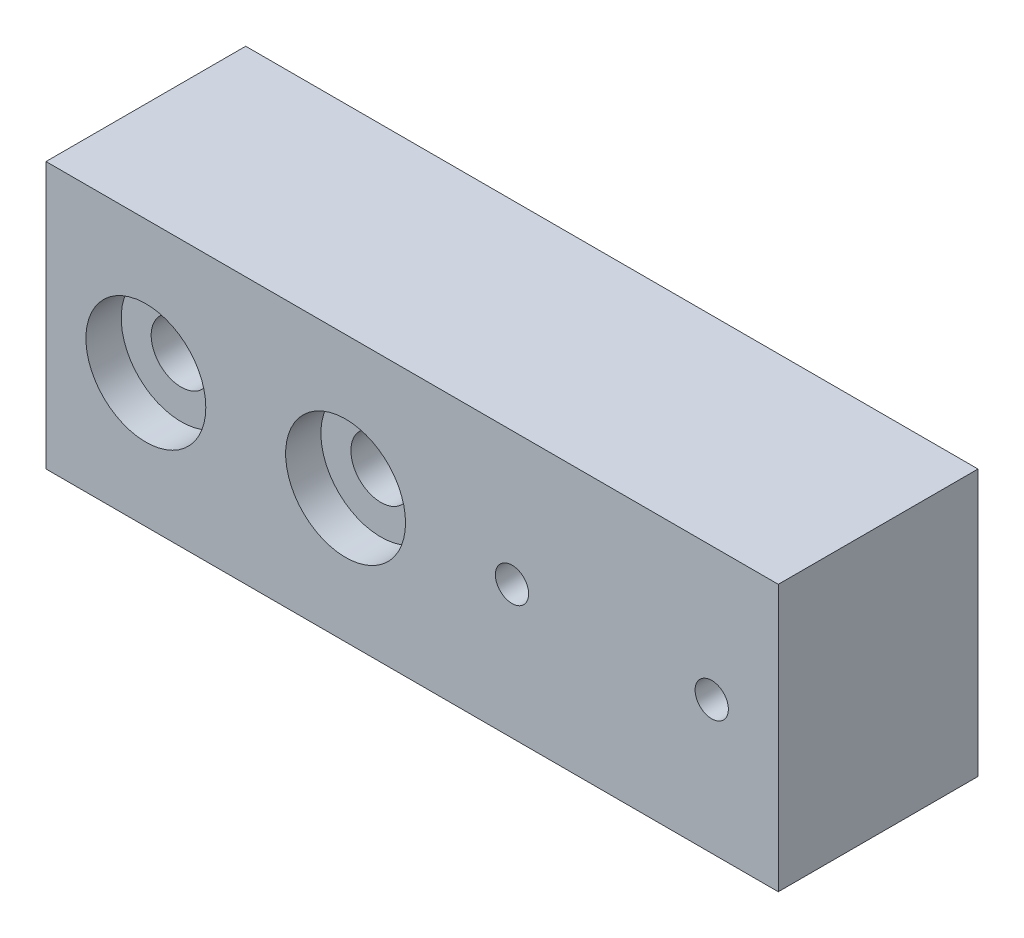
ISO-10303-21;
HEADER;
FILE_DESCRIPTION(('STEP AP214'),'2;1');
FILE_NAME('part.step','',(''),(''),'','','');
FILE_SCHEMA(('AUTOMOTIVE_DESIGN { 1 0 10303 214 1 1 1 1 }'));
ENDSEC;
DATA;
#1=APPLICATION_CONTEXT('core data for automotive mechanical design processes');
#2=APPLICATION_PROTOCOL_DEFINITION('international standard','automotive_design',2000,#1);
#3=PRODUCT_CONTEXT('',#1,'mechanical');
#4=PRODUCT('Part','Part','',(#3));
#5=PRODUCT_RELATED_PRODUCT_CATEGORY('part','',(#4));
#6=PRODUCT_DEFINITION_FORMATION('','',#4);
#7=PRODUCT_DEFINITION_CONTEXT('part definition',#1,'design');
#8=PRODUCT_DEFINITION('design','',#6,#7);
#9=PRODUCT_DEFINITION_SHAPE('','',#8);
#10=(LENGTH_UNIT() NAMED_UNIT(*) SI_UNIT(.MILLI.,.METRE.));
#11=(NAMED_UNIT(*) PLANE_ANGLE_UNIT() SI_UNIT($,.RADIAN.));
#12=(NAMED_UNIT(*) SI_UNIT($,.STERADIAN.) SOLID_ANGLE_UNIT());
#13=UNCERTAINTY_MEASURE_WITH_UNIT(LENGTH_MEASURE(1.E-05),#10,'distance_accuracy_value','');
#14=(GEOMETRIC_REPRESENTATION_CONTEXT(3) GLOBAL_UNCERTAINTY_ASSIGNED_CONTEXT((#13)) GLOBAL_UNIT_ASSIGNED_CONTEXT((#10,
#11,#12)) REPRESENTATION_CONTEXT('',''));
#15=CARTESIAN_POINT('',(0.,0.,0.));
#16=DIRECTION('',(0.,0.,1.));
#17=DIRECTION('',(1.,0.,0.));
#18=AXIS2_PLACEMENT_3D('',#15,#16,#17);
#19=CARTESIAN_POINT('',(-55.,-20.,30.));
#20=DIRECTION('',(1.,0.,0.));
#21=DIRECTION('',(0.,0.,-1.));
#22=AXIS2_PLACEMENT_3D('',#19,#20,#21);
#23=PLANE('',#22);
#24=DIRECTION('',(0.,-1.,0.));
#25=VECTOR('',#24,1.);
#26=CARTESIAN_POINT('',(-55.,-20.,0.));
#27=LINE('',#26,#25);
#28=CARTESIAN_POINT('',(-55.,20.,0.));
#29=VERTEX_POINT('',#28);
#30=CARTESIAN_POINT('',(-55.,-20.,0.));
#31=VERTEX_POINT('',#30);
#32=EDGE_CURVE('E144',#29,#31,#27,.T.);
#33=ORIENTED_EDGE('',*,*,#32,.T.);
#34=DIRECTION('',(0.,0.,-1.));
#35=VECTOR('',#34,1.);
#36=CARTESIAN_POINT('',(-55.,-20.,30.));
#37=LINE('',#36,#35);
#38=CARTESIAN_POINT('',(-55.,-20.,30.));
#39=VERTEX_POINT('',#38);
#40=EDGE_CURVE('E11',#39,#31,#37,.T.);
#41=ORIENTED_EDGE('',*,*,#40,.F.);
#42=DIRECTION('',(0.,-1.,0.));
#43=VECTOR('',#42,1.);
#44=CARTESIAN_POINT('',(-55.,-20.,30.));
#45=LINE('',#44,#43);
#46=CARTESIAN_POINT('',(-55.,20.,30.));
#47=VERTEX_POINT('',#46);
#48=EDGE_CURVE('E143',#47,#39,#45,.T.);
#49=ORIENTED_EDGE('',*,*,#48,.F.);
#50=DIRECTION('',(0.,0.,-1.));
#51=VECTOR('',#50,1.);
#52=CARTESIAN_POINT('',(-55.,20.,30.));
#53=LINE('',#52,#51);
#54=EDGE_CURVE('E151',#47,#29,#53,.T.);
#55=ORIENTED_EDGE('',*,*,#54,.T.);
#56=EDGE_LOOP('',(#33,#41,#49,#55));
#57=FACE_BOUND('',#56,.T.);
#58=ADVANCED_FACE('F44',(#57),#23,.F.);
#59=CARTESIAN_POINT('',(-55.,-20.,30.));
#60=DIRECTION('',(0.,1.,0.));
#61=DIRECTION('',(0.,0.,1.));
#62=AXIS2_PLACEMENT_3D('',#59,#60,#61);
#63=PLANE('',#62);
#64=DIRECTION('',(1.,0.,0.));
#65=VECTOR('',#64,1.);
#66=CARTESIAN_POINT('',(-55.,-20.,0.));
#67=LINE('',#66,#65);
#68=CARTESIAN_POINT('',(55.,-20.,0.));
#69=VERTEX_POINT('',#68);
#70=EDGE_CURVE('E153',#31,#69,#67,.T.);
#71=ORIENTED_EDGE('',*,*,#70,.T.);
#72=DIRECTION('',(0.,0.,-1.));
#73=VECTOR('',#72,1.);
#74=CARTESIAN_POINT('',(55.,-20.,30.));
#75=LINE('',#74,#73);
#76=CARTESIAN_POINT('',(55.,-20.,30.));
#77=VERTEX_POINT('',#76);
#78=EDGE_CURVE('E52',#77,#69,#75,.T.);
#79=ORIENTED_EDGE('',*,*,#78,.F.);
#80=DIRECTION('',(1.,0.,0.));
#81=VECTOR('',#80,1.);
#82=CARTESIAN_POINT('',(-55.,-20.,30.));
#83=LINE('',#82,#81);
#84=EDGE_CURVE('E95',#39,#77,#83,.T.);
#85=ORIENTED_EDGE('',*,*,#84,.F.);
#86=ORIENTED_EDGE('',*,*,#40,.T.);
#87=EDGE_LOOP('',(#71,#79,#85,#86));
#88=FACE_BOUND('',#87,.T.);
#89=ADVANCED_FACE('F177',(#88),#63,.F.);
#90=CARTESIAN_POINT('',(55.,-20.,30.));
#91=DIRECTION('',(-1.,0.,0.));
#92=DIRECTION('',(0.,0.,1.));
#93=AXIS2_PLACEMENT_3D('',#90,#91,#92);
#94=PLANE('',#93);
#95=DIRECTION('',(0.,1.,0.));
#96=VECTOR('',#95,1.);
#97=CARTESIAN_POINT('',(55.,-20.,0.));
#98=LINE('',#97,#96);
#99=CARTESIAN_POINT('',(55.,20.,0.));
#100=VERTEX_POINT('',#99);
#101=EDGE_CURVE('E79',#69,#100,#98,.T.);
#102=ORIENTED_EDGE('',*,*,#101,.T.);
#103=DIRECTION('',(0.,0.,-1.));
#104=VECTOR('',#103,1.);
#105=CARTESIAN_POINT('',(55.,20.,30.));
#106=LINE('',#105,#104);
#107=CARTESIAN_POINT('',(55.,20.,30.));
#108=VERTEX_POINT('',#107);
#109=EDGE_CURVE('E159',#108,#100,#106,.T.);
#110=ORIENTED_EDGE('',*,*,#109,.F.);
#111=DIRECTION('',(0.,1.,0.));
#112=VECTOR('',#111,1.);
#113=CARTESIAN_POINT('',(55.,-20.,30.));
#114=LINE('',#113,#112);
#115=EDGE_CURVE('E147',#77,#108,#114,.T.);
#116=ORIENTED_EDGE('',*,*,#115,.F.);
#117=ORIENTED_EDGE('',*,*,#78,.T.);
#118=EDGE_LOOP('',(#102,#110,#116,#117));
#119=FACE_BOUND('',#118,.T.);
#120=ADVANCED_FACE('F163',(#119),#94,.F.);
#121=CARTESIAN_POINT('',(-55.,20.,30.));
#122=DIRECTION('',(0.,-1.,0.));
#123=DIRECTION('',(0.,0.,-1.));
#124=AXIS2_PLACEMENT_3D('',#121,#122,#123);
#125=PLANE('',#124);
#126=DIRECTION('',(-1.,0.,0.));
#127=VECTOR('',#126,1.);
#128=CARTESIAN_POINT('',(-55.,20.,0.));
#129=LINE('',#128,#127);
#130=EDGE_CURVE('E81',#100,#29,#129,.T.);
#131=ORIENTED_EDGE('',*,*,#130,.T.);
#132=ORIENTED_EDGE('',*,*,#54,.F.);
#133=DIRECTION('',(-1.,0.,0.));
#134=VECTOR('',#133,1.);
#135=CARTESIAN_POINT('',(-55.,20.,30.));
#136=LINE('',#135,#134);
#137=EDGE_CURVE('E63',#108,#47,#136,.T.);
#138=ORIENTED_EDGE('',*,*,#137,.F.);
#139=ORIENTED_EDGE('',*,*,#109,.T.);
#140=EDGE_LOOP('',(#131,#132,#138,#139));
#141=FACE_BOUND('',#140,.T.);
#142=ADVANCED_FACE('F166',(#141),#125,.F.);
#143=CARTESIAN_POINT('',(0.,0.,30.));
#144=DIRECTION('',(0.,0.,-1.));
#145=DIRECTION('',(-1.,0.,0.));
#146=AXIS2_PLACEMENT_3D('',#143,#144,#145);
#147=PLANE('',#146);
#148=CARTESIAN_POINT('',(15.,0.,30.));
#149=DIRECTION('',(0.,0.,1.));
#150=DIRECTION('',(1.,0.,0.));
#151=AXIS2_PLACEMENT_3D('',#148,#149,#150);
#152=CIRCLE('',#151,2.49999999999999);
#153=CARTESIAN_POINT('',(17.5,0.,30.));
#154=VERTEX_POINT('',#153);
#155=EDGE_CURVE('E109',#154,#154,#152,.T.);
#156=ORIENTED_EDGE('',*,*,#155,.F.);
#157=EDGE_LOOP('',(#156));
#158=FACE_BOUND('',#157,.T.);
#159=CARTESIAN_POINT('',(45.,0.,30.));
#160=DIRECTION('',(0.,0.,1.));
#161=DIRECTION('',(1.,0.,0.));
#162=AXIS2_PLACEMENT_3D('',#159,#160,#161);
#163=CIRCLE('',#162,2.49999999999999);
#164=CARTESIAN_POINT('',(47.5,0.,30.));
#165=VERTEX_POINT('',#164);
#166=EDGE_CURVE('E107',#165,#165,#163,.T.);
#167=ORIENTED_EDGE('',*,*,#166,.F.);
#168=EDGE_LOOP('',(#167));
#169=FACE_BOUND('',#168,.T.);
#170=CARTESIAN_POINT('',(-40.,0.,30.));
#171=DIRECTION('',(0.,0.,1.));
#172=DIRECTION('',(1.,0.,0.));
#173=AXIS2_PLACEMENT_3D('',#170,#171,#172);
#174=CIRCLE('',#173,9.0055);
#175=CARTESIAN_POINT('',(-30.9945,0.,30.));
#176=VERTEX_POINT('',#175);
#177=EDGE_CURVE('E119',#176,#176,#174,.T.);
#178=ORIENTED_EDGE('',*,*,#177,.F.);
#179=EDGE_LOOP('',(#178));
#180=FACE_BOUND('',#179,.T.);
#181=CARTESIAN_POINT('',(-10.,0.,30.));
#182=DIRECTION('',(0.,0.,1.));
#183=DIRECTION('',(1.,0.,0.));
#184=AXIS2_PLACEMENT_3D('',#181,#182,#183);
#185=CIRCLE('',#184,9.0055);
#186=CARTESIAN_POINT('',(-0.994500000000006,0.,30.));
#187=VERTEX_POINT('',#186);
#188=EDGE_CURVE('E135',#187,#187,#185,.T.);
#189=ORIENTED_EDGE('',*,*,#188,.F.);
#190=EDGE_LOOP('',(#189));
#191=FACE_BOUND('',#190,.T.);
#192=ORIENTED_EDGE('',*,*,#48,.T.);
#193=ORIENTED_EDGE('',*,*,#84,.T.);
#194=ORIENTED_EDGE('',*,*,#115,.T.);
#195=ORIENTED_EDGE('',*,*,#137,.T.);
#196=EDGE_LOOP('',(#192,#193,#194,#195));
#197=FACE_BOUND('',#196,.T.);
#198=ADVANCED_FACE('F167',(#158,#169,#180,#191,#197),#147,.F.);
#199=CARTESIAN_POINT('',(0.,0.,0.));
#200=DIRECTION('',(0.,0.,-1.));
#201=DIRECTION('',(-1.,0.,0.));
#202=AXIS2_PLACEMENT_3D('',#199,#200,#201);
#203=PLANE('',#202);
#204=CARTESIAN_POINT('',(-40.,0.,0.));
#205=DIRECTION('',(0.,0.,1.));
#206=DIRECTION('',(1.,0.,0.));
#207=AXIS2_PLACEMENT_3D('',#204,#205,#206);
#208=CIRCLE('',#207,4.5);
#209=CARTESIAN_POINT('',(-35.5,0.,0.));
#210=VERTEX_POINT('',#209);
#211=EDGE_CURVE('E130',#210,#210,#208,.T.);
#212=ORIENTED_EDGE('',*,*,#211,.T.);
#213=EDGE_LOOP('',(#212));
#214=FACE_BOUND('',#213,.T.);
#215=CARTESIAN_POINT('',(-10.,0.,0.));
#216=DIRECTION('',(0.,0.,1.));
#217=DIRECTION('',(1.,0.,0.));
#218=AXIS2_PLACEMENT_3D('',#215,#216,#217);
#219=CIRCLE('',#218,4.49999999999999);
#220=CARTESIAN_POINT('',(-5.50000000000001,0.,0.));
#221=VERTEX_POINT('',#220);
#222=EDGE_CURVE('E142',#221,#221,#219,.T.);
#223=ORIENTED_EDGE('',*,*,#222,.T.);
#224=EDGE_LOOP('',(#223));
#225=FACE_BOUND('',#224,.T.);
#226=ORIENTED_EDGE('',*,*,#32,.F.);
#227=ORIENTED_EDGE('',*,*,#130,.F.);
#228=ORIENTED_EDGE('',*,*,#101,.F.);
#229=ORIENTED_EDGE('',*,*,#70,.F.);
#230=EDGE_LOOP('',(#226,#227,#228,#229));
#231=FACE_BOUND('',#230,.T.);
#232=ADVANCED_FACE('F165',(#214,#225,#231),#203,.T.);
#233=CARTESIAN_POINT('',(-10.,0.,30.));
#234=DIRECTION('',(0.,0.,1.));
#235=DIRECTION('',(1.,0.,0.));
#236=AXIS2_PLACEMENT_3D('',#233,#234,#235);
#237=CYLINDRICAL_SURFACE('',#236,4.5);
#238=ORIENTED_EDGE('',*,*,#222,.F.);
#239=EDGE_LOOP('',(#238));
#240=FACE_BOUND('',#239,.T.);
#241=CARTESIAN_POINT('',(-10.,0.,24.7));
#242=DIRECTION('',(0.,0.,1.));
#243=DIRECTION('',(1.,0.,0.));
#244=AXIS2_PLACEMENT_3D('',#241,#242,#243);
#245=CIRCLE('',#244,4.5);
#246=CARTESIAN_POINT('',(-5.5,0.,24.7));
#247=VERTEX_POINT('',#246);
#248=EDGE_CURVE('E138',#247,#247,#245,.T.);
#249=ORIENTED_EDGE('',*,*,#248,.T.);
#250=EDGE_LOOP('',(#249));
#251=FACE_BOUND('',#250,.T.);
#252=ADVANCED_FACE('F216',(#240,#251),#237,.F.);
#253=CARTESIAN_POINT('',(-5.5,0.,24.7));
#254=DIRECTION('',(0.,0.,-1.));
#255=DIRECTION('',(-1.,0.,0.));
#256=AXIS2_PLACEMENT_3D('',#253,#254,#255);
#257=PLANE('',#256);
#258=ORIENTED_EDGE('',*,*,#248,.F.);
#259=EDGE_LOOP('',(#258));
#260=FACE_BOUND('',#259,.T.);
#261=CARTESIAN_POINT('',(-10.,0.,24.7));
#262=DIRECTION('',(0.,0.,1.));
#263=DIRECTION('',(1.,0.,0.));
#264=AXIS2_PLACEMENT_3D('',#261,#262,#263);
#265=CIRCLE('',#264,9.0055);
#266=CARTESIAN_POINT('',(-0.994500000000006,0.,24.7));
#267=VERTEX_POINT('',#266);
#268=EDGE_CURVE('E134',#267,#267,#265,.T.);
#269=ORIENTED_EDGE('',*,*,#268,.T.);
#270=EDGE_LOOP('',(#269));
#271=FACE_BOUND('',#270,.T.);
#272=ADVANCED_FACE('F221',(#260,#271),#257,.F.);
#273=CARTESIAN_POINT('',(-10.,0.,30.));
#274=DIRECTION('',(0.,0.,1.));
#275=DIRECTION('',(1.,0.,0.));
#276=AXIS2_PLACEMENT_3D('',#273,#274,#275);
#277=CYLINDRICAL_SURFACE('',#276,9.0055);
#278=ORIENTED_EDGE('',*,*,#268,.F.);
#279=EDGE_LOOP('',(#278));
#280=FACE_BOUND('',#279,.T.);
#281=ORIENTED_EDGE('',*,*,#188,.T.);
#282=EDGE_LOOP('',(#281));
#283=FACE_BOUND('',#282,.T.);
#284=ADVANCED_FACE('F232',(#280,#283),#277,.F.);
#285=CARTESIAN_POINT('',(-40.,0.,30.));
#286=DIRECTION('',(0.,0.,1.));
#287=DIRECTION('',(1.,0.,0.));
#288=AXIS2_PLACEMENT_3D('',#285,#286,#287);
#289=CYLINDRICAL_SURFACE('',#288,4.5);
#290=ORIENTED_EDGE('',*,*,#211,.F.);
#291=EDGE_LOOP('',(#290));
#292=FACE_BOUND('',#291,.T.);
#293=CARTESIAN_POINT('',(-40.,0.,24.7));
#294=DIRECTION('',(0.,0.,1.));
#295=DIRECTION('',(1.,0.,0.));
#296=AXIS2_PLACEMENT_3D('',#293,#294,#295);
#297=CIRCLE('',#296,4.5);
#298=CARTESIAN_POINT('',(-35.5,0.,24.7));
#299=VERTEX_POINT('',#298);
#300=EDGE_CURVE('E128',#299,#299,#297,.T.);
#301=ORIENTED_EDGE('',*,*,#300,.T.);
#302=EDGE_LOOP('',(#301));
#303=FACE_BOUND('',#302,.T.);
#304=ADVANCED_FACE('F244',(#292,#303),#289,.F.);
#305=CARTESIAN_POINT('',(-35.5,0.,24.7));
#306=DIRECTION('',(0.,0.,-1.));
#307=DIRECTION('',(-1.,0.,0.));
#308=AXIS2_PLACEMENT_3D('',#305,#306,#307);
#309=PLANE('',#308);
#310=ORIENTED_EDGE('',*,*,#300,.F.);
#311=EDGE_LOOP('',(#310));
#312=FACE_BOUND('',#311,.T.);
#313=CARTESIAN_POINT('',(-40.,0.,24.7));
#314=DIRECTION('',(0.,0.,1.));
#315=DIRECTION('',(1.,0.,0.));
#316=AXIS2_PLACEMENT_3D('',#313,#314,#315);
#317=CIRCLE('',#316,9.0055);
#318=CARTESIAN_POINT('',(-30.9945,0.,24.7));
#319=VERTEX_POINT('',#318);
#320=EDGE_CURVE('E124',#319,#319,#317,.T.);
#321=ORIENTED_EDGE('',*,*,#320,.T.);
#322=EDGE_LOOP('',(#321));
#323=FACE_BOUND('',#322,.T.);
#324=ADVANCED_FACE('F253',(#312,#323),#309,.F.);
#325=CARTESIAN_POINT('',(-40.,0.,30.));
#326=DIRECTION('',(0.,0.,1.));
#327=DIRECTION('',(1.,0.,0.));
#328=AXIS2_PLACEMENT_3D('',#325,#326,#327);
#329=CYLINDRICAL_SURFACE('',#328,9.0055);
#330=ORIENTED_EDGE('',*,*,#320,.F.);
#331=EDGE_LOOP('',(#330));
#332=FACE_BOUND('',#331,.T.);
#333=ORIENTED_EDGE('',*,*,#177,.T.);
#334=EDGE_LOOP('',(#333));
#335=FACE_BOUND('',#334,.T.);
#336=ADVANCED_FACE('F264',(#332,#335),#329,.F.);
#337=CARTESIAN_POINT('',(45.,0.,20.));
#338=DIRECTION('',(0.,0.,1.));
#339=DIRECTION('',(1.,0.,0.));
#340=AXIS2_PLACEMENT_3D('',#337,#338,#339);
#341=CONICAL_SURFACE('',#340,2.5,1.02974425867665);
#342=CARTESIAN_POINT('',(45.,0.,18.4978484524311));
#343=VERTEX_POINT('',#342);
#344=VERTEX_LOOP('',#343);
#345=FACE_BOUND('',#344,.T.);
#346=CARTESIAN_POINT('',(45.,0.,20.));
#347=DIRECTION('',(0.,0.,1.));
#348=DIRECTION('',(1.,0.,0.));
#349=AXIS2_PLACEMENT_3D('',#346,#347,#348);
#350=CIRCLE('',#349,2.5);
#351=CARTESIAN_POINT('',(47.5,0.,20.));
#352=VERTEX_POINT('',#351);
#353=EDGE_CURVE('E113',#352,#352,#350,.T.);
#354=ORIENTED_EDGE('',*,*,#353,.T.);
#355=EDGE_LOOP('',(#354));
#356=FACE_BOUND('',#355,.T.);
#357=ADVANCED_FACE('F274',(#345,#356),#341,.F.);
#358=CARTESIAN_POINT('',(45.,0.,30.));
#359=DIRECTION('',(0.,0.,1.));
#360=DIRECTION('',(1.,0.,0.));
#361=AXIS2_PLACEMENT_3D('',#358,#359,#360);
#362=CYLINDRICAL_SURFACE('',#361,2.49999999999999);
#363=ORIENTED_EDGE('',*,*,#353,.F.);
#364=EDGE_LOOP('',(#363));
#365=FACE_BOUND('',#364,.T.);
#366=ORIENTED_EDGE('',*,*,#166,.T.);
#367=EDGE_LOOP('',(#366));
#368=FACE_BOUND('',#367,.T.);
#369=ADVANCED_FACE('F101',(#365,#368),#362,.F.);
#370=CARTESIAN_POINT('',(15.,0.,20.));
#371=DIRECTION('',(0.,0.,1.));
#372=DIRECTION('',(1.,0.,0.));
#373=AXIS2_PLACEMENT_3D('',#370,#371,#372);
#374=CONICAL_SURFACE('',#373,2.5,1.02974425867665);
#375=CARTESIAN_POINT('',(15.,0.,18.4978484524311));
#376=VERTEX_POINT('',#375);
#377=VERTEX_LOOP('',#376);
#378=FACE_BOUND('',#377,.T.);
#379=CARTESIAN_POINT('',(15.,0.,20.));
#380=DIRECTION('',(0.,0.,1.));
#381=DIRECTION('',(1.,0.,0.));
#382=AXIS2_PLACEMENT_3D('',#379,#380,#381);
#383=CIRCLE('',#382,2.5);
#384=CARTESIAN_POINT('',(17.5,0.,20.));
#385=VERTEX_POINT('',#384);
#386=EDGE_CURVE('E110',#385,#385,#383,.T.);
#387=ORIENTED_EDGE('',*,*,#386,.T.);
#388=EDGE_LOOP('',(#387));
#389=FACE_BOUND('',#388,.T.);
#390=ADVANCED_FACE('F100',(#378,#389),#374,.F.);
#391=CARTESIAN_POINT('',(15.,0.,30.));
#392=DIRECTION('',(0.,0.,1.));
#393=DIRECTION('',(1.,0.,0.));
#394=AXIS2_PLACEMENT_3D('',#391,#392,#393);
#395=CYLINDRICAL_SURFACE('',#394,2.49999999999999);
#396=ORIENTED_EDGE('',*,*,#386,.F.);
#397=EDGE_LOOP('',(#396));
#398=FACE_BOUND('',#397,.T.);
#399=ORIENTED_EDGE('',*,*,#155,.T.);
#400=EDGE_LOOP('',(#399));
#401=FACE_BOUND('',#400,.T.);
#402=ADVANCED_FACE('F105',(#398,#401),#395,.F.);
#403=CLOSED_SHELL('',(#58,#89,#120,#142,#198,#232,#252,#272,#284,#304,#324,#336,#357,#369,#390,#402));
#404=MANIFOLD_SOLID_BREP('B2',#403);
#405=ADVANCED_BREP_SHAPE_REPRESENTATION('',(#18,#404),#14);
#406=SHAPE_DEFINITION_REPRESENTATION(#9,#405);
ENDSEC;
END-ISO-10303-21;
